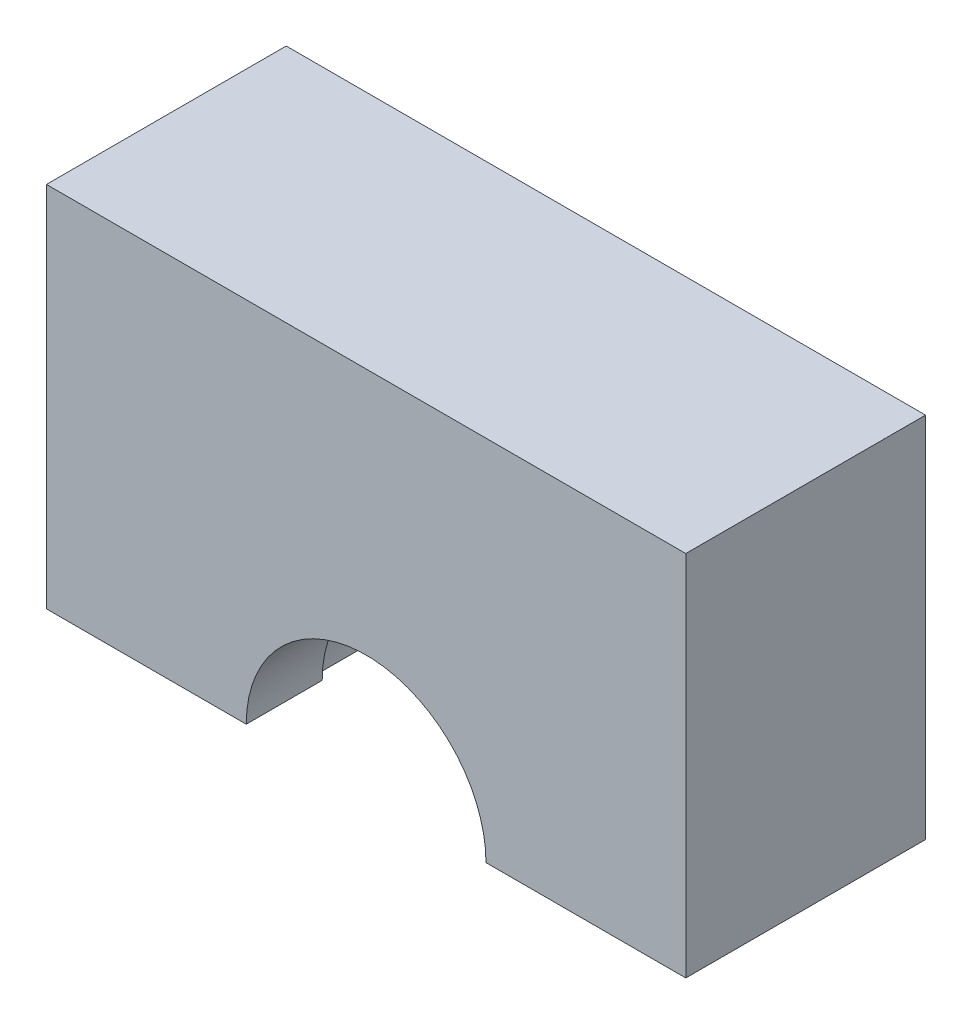
ISO-10303-21;
HEADER;
FILE_DESCRIPTION(('STEP AP214'),'2;1');
FILE_NAME('part.step','',(''),(''),'','','');
FILE_SCHEMA(('AUTOMOTIVE_DESIGN { 1 0 10303 214 1 1 1 1 }'));
ENDSEC;
DATA;
#1=APPLICATION_CONTEXT('core data for automotive mechanical design processes');
#2=APPLICATION_PROTOCOL_DEFINITION('international standard','automotive_design',2000,#1);
#3=PRODUCT_CONTEXT('',#1,'mechanical');
#4=PRODUCT('Part','Part','',(#3));
#5=PRODUCT_RELATED_PRODUCT_CATEGORY('part','',(#4));
#6=PRODUCT_DEFINITION_FORMATION('','',#4);
#7=PRODUCT_DEFINITION_CONTEXT('part definition',#1,'design');
#8=PRODUCT_DEFINITION('design','',#6,#7);
#9=PRODUCT_DEFINITION_SHAPE('','',#8);
#10=(LENGTH_UNIT() NAMED_UNIT(*) SI_UNIT(.MILLI.,.METRE.));
#11=(NAMED_UNIT(*) PLANE_ANGLE_UNIT() SI_UNIT($,.RADIAN.));
#12=(NAMED_UNIT(*) SI_UNIT($,.STERADIAN.) SOLID_ANGLE_UNIT());
#13=UNCERTAINTY_MEASURE_WITH_UNIT(LENGTH_MEASURE(1.E-05),#10,'distance_accuracy_value','');
#14=(GEOMETRIC_REPRESENTATION_CONTEXT(3) GLOBAL_UNCERTAINTY_ASSIGNED_CONTEXT((#13)) GLOBAL_UNIT_ASSIGNED_CONTEXT((#10,
#11,#12)) REPRESENTATION_CONTEXT('',''));
#15=CARTESIAN_POINT('',(0.,0.,0.));
#16=DIRECTION('',(0.,0.,1.));
#17=DIRECTION('',(1.,0.,0.));
#18=AXIS2_PLACEMENT_3D('',#15,#16,#17);
#19=CARTESIAN_POINT('',(0.,0.,15.));
#20=DIRECTION('',(0.,0.,-1.));
#21=DIRECTION('',(-1.,0.,0.));
#22=AXIS2_PLACEMENT_3D('',#19,#20,#21);
#23=CYLINDRICAL_SURFACE('',#22,7.5);
#24=CARTESIAN_POINT('',(0.,0.,4.75));
#25=DIRECTION('',(0.,0.,-1.));
#26=DIRECTION('',(0.,1.,0.));
#27=AXIS2_PLACEMENT_3D('',#24,#25,#26);
#28=CIRCLE('',#27,7.5);
#29=CARTESIAN_POINT('',(-7.5,0.,4.75));
#30=VERTEX_POINT('',#29);
#31=CARTESIAN_POINT('',(7.5,0.,4.75));
#32=VERTEX_POINT('',#31);
#33=EDGE_CURVE('E199',#30,#32,#28,.T.);
#34=ORIENTED_EDGE('',*,*,#33,.F.);
#35=DIRECTION('',(0.,0.,-1.));
#36=VECTOR('',#35,1.);
#37=CARTESIAN_POINT('',(-7.5,0.,15.));
#38=LINE('',#37,#36);
#39=CARTESIAN_POINT('',(-7.5,0.,0.));
#40=VERTEX_POINT('',#39);
#41=EDGE_CURVE('E92',#30,#40,#38,.T.);
#42=ORIENTED_EDGE('',*,*,#41,.T.);
#43=CARTESIAN_POINT('',(0.,0.,0.));
#44=DIRECTION('',(0.,0.,1.));
#45=DIRECTION('',(1.,0.,0.));
#46=AXIS2_PLACEMENT_3D('',#43,#44,#45);
#47=CIRCLE('',#46,7.5);
#48=CARTESIAN_POINT('',(7.5,0.,0.));
#49=VERTEX_POINT('',#48);
#50=EDGE_CURVE('E137',#49,#40,#47,.T.);
#51=ORIENTED_EDGE('',*,*,#50,.F.);
#52=DIRECTION('',(0.,0.,-1.));
#53=VECTOR('',#52,1.);
#54=CARTESIAN_POINT('',(7.5,0.,15.));
#55=LINE('',#54,#53);
#56=EDGE_CURVE('E160',#32,#49,#55,.T.);
#57=ORIENTED_EDGE('',*,*,#56,.F.);
#58=EDGE_LOOP('',(#34,#42,#51,#57));
#59=FACE_BOUND('',#58,.T.);
#60=ADVANCED_FACE('F39',(#59),#23,.F.);
#61=CARTESIAN_POINT('',(0.,0.,10.25));
#62=DIRECTION('',(0.,0.,1.));
#63=DIRECTION('',(0.,-1.,0.));
#64=AXIS2_PLACEMENT_3D('',#61,#62,#63);
#65=CIRCLE('',#64,7.5);
#66=CARTESIAN_POINT('',(7.5,0.,10.25));
#67=VERTEX_POINT('',#66);
#68=CARTESIAN_POINT('',(-7.5,0.,10.25));
#69=VERTEX_POINT('',#68);
#70=EDGE_CURVE('E54',#67,#69,#65,.T.);
#71=ORIENTED_EDGE('',*,*,#70,.F.);
#72=CARTESIAN_POINT('',(7.5,0.,15.));
#73=VERTEX_POINT('',#72);
#74=EDGE_CURVE('E100',#73,#67,#55,.T.);
#75=ORIENTED_EDGE('',*,*,#74,.F.);
#76=CARTESIAN_POINT('',(0.,0.,15.));
#77=DIRECTION('',(0.,0.,1.));
#78=DIRECTION('',(1.,0.,0.));
#79=AXIS2_PLACEMENT_3D('',#76,#77,#78);
#80=CIRCLE('',#79,7.5);
#81=CARTESIAN_POINT('',(-7.5,0.,15.));
#82=VERTEX_POINT('',#81);
#83=EDGE_CURVE('E152',#73,#82,#80,.T.);
#84=ORIENTED_EDGE('',*,*,#83,.T.);
#85=EDGE_CURVE('E153',#82,#69,#38,.T.);
#86=ORIENTED_EDGE('',*,*,#85,.T.);
#87=EDGE_LOOP('',(#71,#75,#84,#86));
#88=FACE_BOUND('',#87,.T.);
#89=ADVANCED_FACE('F41',(#88),#23,.F.);
#90=CARTESIAN_POINT('',(0.,0.,15.));
#91=DIRECTION('',(0.,-1.,0.));
#92=DIRECTION('',(0.,0.,-1.));
#93=AXIS2_PLACEMENT_3D('',#90,#91,#92);
#94=PLANE('',#93);
#95=DIRECTION('',(1.,0.,0.));
#96=VECTOR('',#95,1.);
#97=CARTESIAN_POINT('',(0.,0.,4.75));
#98=LINE('',#97,#96);
#99=CARTESIAN_POINT('',(8.,0.,4.75));
#100=VERTEX_POINT('',#99);
#101=EDGE_CURVE('E141',#32,#100,#98,.T.);
#102=ORIENTED_EDGE('',*,*,#101,.F.);
#103=ORIENTED_EDGE('',*,*,#56,.T.);
#104=DIRECTION('',(-1.,0.,0.));
#105=VECTOR('',#104,1.);
#106=CARTESIAN_POINT('',(0.,0.,0.));
#107=LINE('',#106,#105);
#108=CARTESIAN_POINT('',(20.,0.,0.));
#109=VERTEX_POINT('',#108);
#110=EDGE_CURVE('E140',#109,#49,#107,.T.);
#111=ORIENTED_EDGE('',*,*,#110,.F.);
#112=DIRECTION('',(0.,0.,-1.));
#113=VECTOR('',#112,1.);
#114=CARTESIAN_POINT('',(20.,0.,15.));
#115=LINE('',#114,#113);
#116=CARTESIAN_POINT('',(20.,0.,15.));
#117=VERTEX_POINT('',#116);
#118=EDGE_CURVE('E158',#117,#109,#115,.T.);
#119=ORIENTED_EDGE('',*,*,#118,.F.);
#120=DIRECTION('',(-1.,0.,0.));
#121=VECTOR('',#120,1.);
#122=CARTESIAN_POINT('',(0.,0.,15.));
#123=LINE('',#122,#121);
#124=EDGE_CURVE('E203',#117,#73,#123,.T.);
#125=ORIENTED_EDGE('',*,*,#124,.T.);
#126=ORIENTED_EDGE('',*,*,#74,.T.);
#127=DIRECTION('',(-1.,0.,0.));
#128=VECTOR('',#127,1.);
#129=CARTESIAN_POINT('',(0.,0.,10.25));
#130=LINE('',#129,#128);
#131=CARTESIAN_POINT('',(8.,0.,10.25));
#132=VERTEX_POINT('',#131);
#133=EDGE_CURVE('E192',#132,#67,#130,.T.);
#134=ORIENTED_EDGE('',*,*,#133,.F.);
#135=DIRECTION('',(0.,0.,-1.));
#136=VECTOR('',#135,1.);
#137=CARTESIAN_POINT('',(8.,0.,0.));
#138=LINE('',#137,#136);
#139=EDGE_CURVE('E197',#100,#132,#138,.F.);
#140=ORIENTED_EDGE('',*,*,#139,.F.);
#141=EDGE_LOOP('',(#102,#103,#111,#119,#125,#126,#134,#140));
#142=FACE_BOUND('',#141,.T.);
#143=ADVANCED_FACE('F213',(#142),#94,.T.);
#144=CARTESIAN_POINT('',(20.,0.,15.));
#145=DIRECTION('',(1.,0.,0.));
#146=DIRECTION('',(0.,1.,0.));
#147=AXIS2_PLACEMENT_3D('',#144,#145,#146);
#148=PLANE('',#147);
#149=DIRECTION('',(0.,-1.,0.));
#150=VECTOR('',#149,1.);
#151=CARTESIAN_POINT('',(20.,0.,0.));
#152=LINE('',#151,#150);
#153=CARTESIAN_POINT('',(20.,23.,0.));
#154=VERTEX_POINT('',#153);
#155=EDGE_CURVE('E144',#154,#109,#152,.T.);
#156=ORIENTED_EDGE('',*,*,#155,.F.);
#157=DIRECTION('',(0.,0.,-1.));
#158=VECTOR('',#157,1.);
#159=CARTESIAN_POINT('',(20.,23.,15.));
#160=LINE('',#159,#158);
#161=CARTESIAN_POINT('',(20.,23.,15.));
#162=VERTEX_POINT('',#161);
#163=EDGE_CURVE('E122',#162,#154,#160,.T.);
#164=ORIENTED_EDGE('',*,*,#163,.F.);
#165=DIRECTION('',(0.,-1.,0.));
#166=VECTOR('',#165,1.);
#167=CARTESIAN_POINT('',(20.,0.,15.));
#168=LINE('',#167,#166);
#169=EDGE_CURVE('E130',#162,#117,#168,.T.);
#170=ORIENTED_EDGE('',*,*,#169,.T.);
#171=ORIENTED_EDGE('',*,*,#118,.T.);
#172=EDGE_LOOP('',(#156,#164,#170,#171));
#173=FACE_BOUND('',#172,.T.);
#174=ADVANCED_FACE('F207',(#173),#148,.T.);
#175=CARTESIAN_POINT('',(0.,23.,15.));
#176=DIRECTION('',(0.,1.,0.));
#177=DIRECTION('',(0.,0.,1.));
#178=AXIS2_PLACEMENT_3D('',#175,#176,#177);
#179=PLANE('',#178);
#180=DIRECTION('',(1.,0.,0.));
#181=VECTOR('',#180,1.);
#182=CARTESIAN_POINT('',(0.,23.,0.));
#183=LINE('',#182,#181);
#184=CARTESIAN_POINT('',(-20.,23.,0.));
#185=VERTEX_POINT('',#184);
#186=EDGE_CURVE('E117',#185,#154,#183,.T.);
#187=ORIENTED_EDGE('',*,*,#186,.F.);
#188=DIRECTION('',(0.,0.,-1.));
#189=VECTOR('',#188,1.);
#190=CARTESIAN_POINT('',(-20.,23.,15.));
#191=LINE('',#190,#189);
#192=CARTESIAN_POINT('',(-20.,23.,15.));
#193=VERTEX_POINT('',#192);
#194=EDGE_CURVE('E112',#193,#185,#191,.T.);
#195=ORIENTED_EDGE('',*,*,#194,.F.);
#196=DIRECTION('',(1.,0.,0.));
#197=VECTOR('',#196,1.);
#198=CARTESIAN_POINT('',(0.,23.,15.));
#199=LINE('',#198,#197);
#200=EDGE_CURVE('E115',#193,#162,#199,.T.);
#201=ORIENTED_EDGE('',*,*,#200,.T.);
#202=ORIENTED_EDGE('',*,*,#163,.T.);
#203=EDGE_LOOP('',(#187,#195,#201,#202));
#204=FACE_BOUND('',#203,.T.);
#205=ADVANCED_FACE('F114',(#204),#179,.T.);
#206=CARTESIAN_POINT('',(-20.,0.,15.));
#207=DIRECTION('',(-1.,0.,0.));
#208=DIRECTION('',(0.,-1.,0.));
#209=AXIS2_PLACEMENT_3D('',#206,#207,#208);
#210=PLANE('',#209);
#211=DIRECTION('',(0.,1.,0.));
#212=VECTOR('',#211,1.);
#213=CARTESIAN_POINT('',(-20.,0.,0.));
#214=LINE('',#213,#212);
#215=CARTESIAN_POINT('',(-20.,0.,0.));
#216=VERTEX_POINT('',#215);
#217=EDGE_CURVE('E148',#216,#185,#214,.T.);
#218=ORIENTED_EDGE('',*,*,#217,.F.);
#219=DIRECTION('',(0.,0.,-1.));
#220=VECTOR('',#219,1.);
#221=CARTESIAN_POINT('',(-20.,0.,15.));
#222=LINE('',#221,#220);
#223=CARTESIAN_POINT('',(-20.,0.,15.));
#224=VERTEX_POINT('',#223);
#225=EDGE_CURVE('E123',#224,#216,#222,.T.);
#226=ORIENTED_EDGE('',*,*,#225,.F.);
#227=DIRECTION('',(0.,1.,0.));
#228=VECTOR('',#227,1.);
#229=CARTESIAN_POINT('',(-20.,0.,15.));
#230=LINE('',#229,#228);
#231=EDGE_CURVE('E127',#224,#193,#230,.T.);
#232=ORIENTED_EDGE('',*,*,#231,.T.);
#233=ORIENTED_EDGE('',*,*,#194,.T.);
#234=EDGE_LOOP('',(#218,#226,#232,#233));
#235=FACE_BOUND('',#234,.T.);
#236=ADVANCED_FACE('F132',(#235),#210,.T.);
#237=CARTESIAN_POINT('',(0.,0.,15.));
#238=DIRECTION('',(0.,1.,0.));
#239=DIRECTION('',(0.,0.,1.));
#240=AXIS2_PLACEMENT_3D('',#237,#238,#239);
#241=PLANE('',#240);
#242=ORIENTED_EDGE('',*,*,#41,.F.);
#243=DIRECTION('',(-1.,0.,0.));
#244=VECTOR('',#243,1.);
#245=CARTESIAN_POINT('',(0.,0.,4.75));
#246=LINE('',#245,#244);
#247=CARTESIAN_POINT('',(-8.,0.,4.75));
#248=VERTEX_POINT('',#247);
#249=EDGE_CURVE('E11',#30,#248,#246,.T.);
#250=ORIENTED_EDGE('',*,*,#249,.T.);
#251=DIRECTION('',(0.,0.,-1.));
#252=VECTOR('',#251,1.);
#253=CARTESIAN_POINT('',(-8.,0.,0.));
#254=LINE('',#253,#252);
#255=CARTESIAN_POINT('',(-8.,0.,10.25));
#256=VERTEX_POINT('',#255);
#257=EDGE_CURVE('E47',#248,#256,#254,.F.);
#258=ORIENTED_EDGE('',*,*,#257,.T.);
#259=DIRECTION('',(1.,0.,0.));
#260=VECTOR('',#259,1.);
#261=CARTESIAN_POINT('',(0.,0.,10.25));
#262=LINE('',#261,#260);
#263=EDGE_CURVE('E162',#256,#69,#262,.T.);
#264=ORIENTED_EDGE('',*,*,#263,.T.);
#265=ORIENTED_EDGE('',*,*,#85,.F.);
#266=DIRECTION('',(1.,0.,0.));
#267=VECTOR('',#266,1.);
#268=CARTESIAN_POINT('',(0.,0.,15.));
#269=LINE('',#268,#267);
#270=EDGE_CURVE('E63',#224,#82,#269,.T.);
#271=ORIENTED_EDGE('',*,*,#270,.F.);
#272=ORIENTED_EDGE('',*,*,#225,.T.);
#273=DIRECTION('',(1.,0.,0.));
#274=VECTOR('',#273,1.);
#275=CARTESIAN_POINT('',(0.,0.,0.));
#276=LINE('',#275,#274);
#277=EDGE_CURVE('E150',#216,#40,#276,.T.);
#278=ORIENTED_EDGE('',*,*,#277,.T.);
#279=EDGE_LOOP('',(#242,#250,#258,#264,#265,#271,#272,#278));
#280=FACE_BOUND('',#279,.T.);
#281=ADVANCED_FACE('F167',(#280),#241,.F.);
#282=CARTESIAN_POINT('',(0.,0.,15.));
#283=DIRECTION('',(0.,0.,1.));
#284=DIRECTION('',(1.,0.,0.));
#285=AXIS2_PLACEMENT_3D('',#282,#283,#284);
#286=PLANE('',#285);
#287=ORIENTED_EDGE('',*,*,#83,.F.);
#288=ORIENTED_EDGE('',*,*,#124,.F.);
#289=ORIENTED_EDGE('',*,*,#169,.F.);
#290=ORIENTED_EDGE('',*,*,#200,.F.);
#291=ORIENTED_EDGE('',*,*,#231,.F.);
#292=ORIENTED_EDGE('',*,*,#270,.T.);
#293=EDGE_LOOP('',(#287,#288,#289,#290,#291,#292));
#294=FACE_BOUND('',#293,.T.);
#295=ADVANCED_FACE('F126',(#294),#286,.T.);
#296=CARTESIAN_POINT('',(0.,0.,0.));
#297=DIRECTION('',(0.,0.,1.));
#298=DIRECTION('',(1.,0.,0.));
#299=AXIS2_PLACEMENT_3D('',#296,#297,#298);
#300=PLANE('',#299);
#301=ORIENTED_EDGE('',*,*,#50,.T.);
#302=ORIENTED_EDGE('',*,*,#277,.F.);
#303=ORIENTED_EDGE('',*,*,#217,.T.);
#304=ORIENTED_EDGE('',*,*,#186,.T.);
#305=ORIENTED_EDGE('',*,*,#155,.T.);
#306=ORIENTED_EDGE('',*,*,#110,.T.);
#307=EDGE_LOOP('',(#301,#302,#303,#304,#305,#306));
#308=FACE_BOUND('',#307,.T.);
#309=ADVANCED_FACE('F210',(#308),#300,.F.);
#310=CARTESIAN_POINT('',(0.,6.48245362379317,4.75));
#311=DIRECTION('',(0.,0.,-1.));
#312=DIRECTION('',(0.,1.,0.));
#313=AXIS2_PLACEMENT_3D('',#310,#311,#312);
#314=PLANE('',#313);
#315=ORIENTED_EDGE('',*,*,#101,.T.);
#316=CARTESIAN_POINT('',(0.,0.,4.75));
#317=DIRECTION('',(0.,0.,-1.));
#318=DIRECTION('',(0.,1.,0.));
#319=AXIS2_PLACEMENT_3D('',#316,#317,#318);
#320=CIRCLE('',#319,8.);
#321=EDGE_CURVE('E180',#248,#100,#320,.T.);
#322=ORIENTED_EDGE('',*,*,#321,.F.);
#323=ORIENTED_EDGE('',*,*,#249,.F.);
#324=ORIENTED_EDGE('',*,*,#33,.T.);
#325=EDGE_LOOP('',(#315,#322,#323,#324));
#326=FACE_BOUND('',#325,.T.);
#327=ADVANCED_FACE('F188',(#326),#314,.F.);
#328=CARTESIAN_POINT('',(0.,0.,0.));
#329=DIRECTION('',(0.,0.,-1.));
#330=DIRECTION('',(0.,1.,0.));
#331=AXIS2_PLACEMENT_3D('',#328,#329,#330);
#332=CYLINDRICAL_SURFACE('',#331,8.);
#333=ORIENTED_EDGE('',*,*,#139,.T.);
#334=CARTESIAN_POINT('',(0.,0.,10.25));
#335=DIRECTION('',(0.,0.,-1.));
#336=DIRECTION('',(0.,1.,0.));
#337=AXIS2_PLACEMENT_3D('',#334,#335,#336);
#338=CIRCLE('',#337,8.);
#339=EDGE_CURVE('E183',#256,#132,#338,.T.);
#340=ORIENTED_EDGE('',*,*,#339,.F.);
#341=ORIENTED_EDGE('',*,*,#257,.F.);
#342=ORIENTED_EDGE('',*,*,#321,.T.);
#343=EDGE_LOOP('',(#333,#340,#341,#342));
#344=FACE_BOUND('',#343,.T.);
#345=ADVANCED_FACE('F178',(#344),#332,.F.);
#346=CARTESIAN_POINT('',(0.,6.48245362379317,10.25));
#347=DIRECTION('',(0.,0.,1.));
#348=DIRECTION('',(0.,-1.,0.));
#349=AXIS2_PLACEMENT_3D('',#346,#347,#348);
#350=PLANE('',#349);
#351=ORIENTED_EDGE('',*,*,#133,.T.);
#352=ORIENTED_EDGE('',*,*,#70,.T.);
#353=ORIENTED_EDGE('',*,*,#263,.F.);
#354=ORIENTED_EDGE('',*,*,#339,.T.);
#355=EDGE_LOOP('',(#351,#352,#353,#354));
#356=FACE_BOUND('',#355,.T.);
#357=ADVANCED_FACE('F242',(#356),#350,.F.);
#358=CLOSED_SHELL('',(#60,#89,#143,#174,#205,#236,#281,#295,#309,#327,#345,#357));
#359=MANIFOLD_SOLID_BREP('B2',#358);
#360=ADVANCED_BREP_SHAPE_REPRESENTATION('',(#18,#359),#14);
#361=SHAPE_DEFINITION_REPRESENTATION(#9,#360);
ENDSEC;
END-ISO-10303-21;
